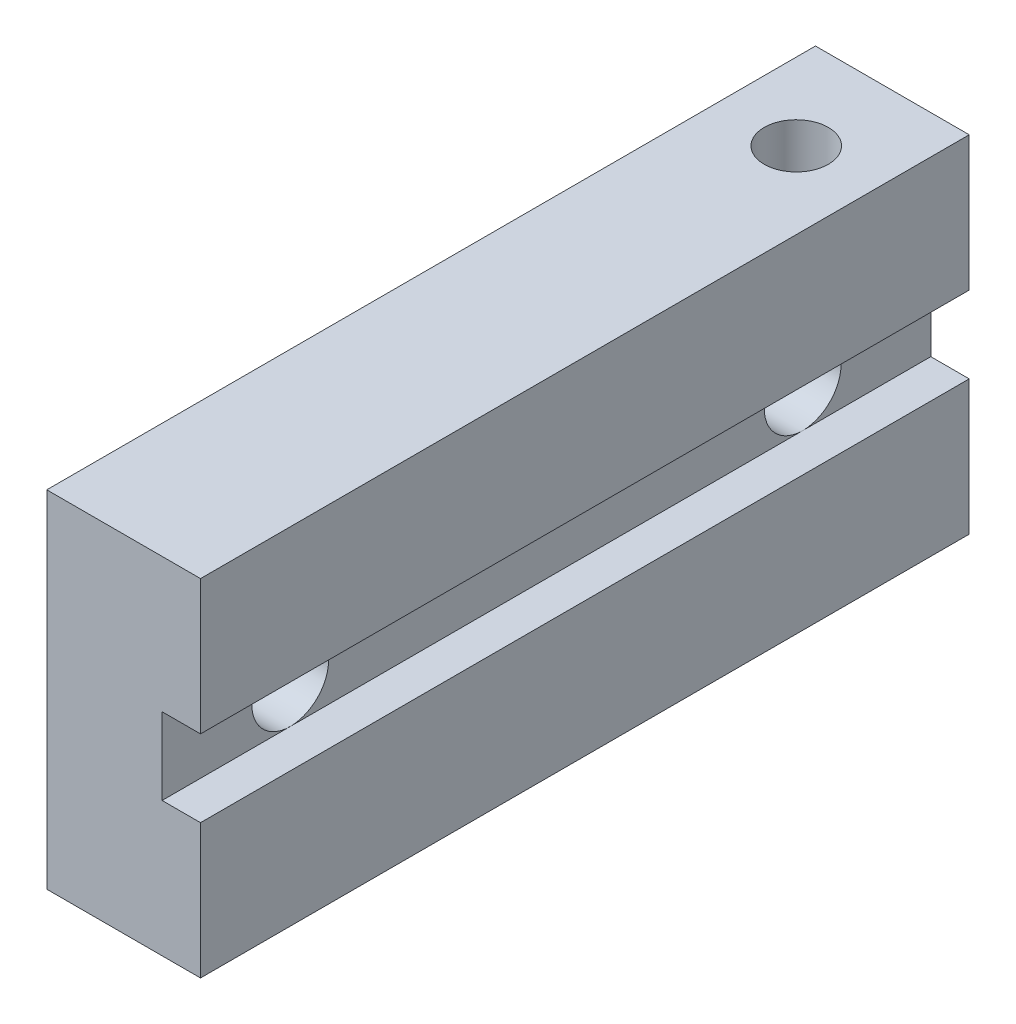
ISO-10303-21;
HEADER;
FILE_DESCRIPTION(('STEP AP214'),'2;1');
FILE_NAME('part.step','',(''),(''),'','','');
FILE_SCHEMA(('AUTOMOTIVE_DESIGN { 1 0 10303 214 1 1 1 1 }'));
ENDSEC;
DATA;
#1=APPLICATION_CONTEXT('core data for automotive mechanical design processes');
#2=APPLICATION_PROTOCOL_DEFINITION('international standard','automotive_design',2000,#1);
#3=PRODUCT_CONTEXT('',#1,'mechanical');
#4=PRODUCT('Part','Part','',(#3));
#5=PRODUCT_RELATED_PRODUCT_CATEGORY('part','',(#4));
#6=PRODUCT_DEFINITION_FORMATION('','',#4);
#7=PRODUCT_DEFINITION_CONTEXT('part definition',#1,'design');
#8=PRODUCT_DEFINITION('design','',#6,#7);
#9=PRODUCT_DEFINITION_SHAPE('','',#8);
#10=(LENGTH_UNIT() NAMED_UNIT(*) SI_UNIT(.MILLI.,.METRE.));
#11=(NAMED_UNIT(*) PLANE_ANGLE_UNIT() SI_UNIT($,.RADIAN.));
#12=(NAMED_UNIT(*) SI_UNIT($,.STERADIAN.) SOLID_ANGLE_UNIT());
#13=UNCERTAINTY_MEASURE_WITH_UNIT(LENGTH_MEASURE(1.E-05),#10,'distance_accuracy_value','');
#14=(GEOMETRIC_REPRESENTATION_CONTEXT(3) GLOBAL_UNCERTAINTY_ASSIGNED_CONTEXT((#13)) GLOBAL_UNIT_ASSIGNED_CONTEXT((#10,
#11,#12)) REPRESENTATION_CONTEXT('',''));
#15=CARTESIAN_POINT('',(0.,0.,0.));
#16=DIRECTION('',(0.,0.,1.));
#17=DIRECTION('',(1.,0.,0.));
#18=AXIS2_PLACEMENT_3D('',#15,#16,#17);
#19=CARTESIAN_POINT('',(8.99999999999999,0.,0.));
#20=DIRECTION('',(1.,0.,0.));
#21=DIRECTION('',(0.,0.,-1.));
#22=AXIS2_PLACEMENT_3D('',#19,#20,#21);
#23=PLANE('',#22);
#24=CARTESIAN_POINT('',(8.99999999999999,0.,20.));
#25=DIRECTION('',(1.,0.,0.));
#26=DIRECTION('',(0.,0.,-1.));
#27=AXIS2_PLACEMENT_3D('',#24,#25,#26);
#28=CIRCLE('',#27,3.);
#29=CARTESIAN_POINT('',(8.99999999999999,3.,20.));
#30=VERTEX_POINT('',#29);
#31=CARTESIAN_POINT('',(8.99999999999999,-3.,20.));
#32=VERTEX_POINT('',#31);
#33=EDGE_CURVE('E47',#30,#32,#28,.T.);
#34=ORIENTED_EDGE('',*,*,#33,.F.);
#35=DIRECTION('',(0.,0.,1.));
#36=VECTOR('',#35,1.);
#37=CARTESIAN_POINT('',(8.99999999999999,3.,0.));
#38=LINE('',#37,#36);
#39=CARTESIAN_POINT('',(8.99999999999999,3.,30.));
#40=VERTEX_POINT('',#39);
#41=EDGE_CURVE('E177',#30,#40,#38,.T.);
#42=ORIENTED_EDGE('',*,*,#41,.T.);
#43=DIRECTION('',(0.,1.,0.));
#44=VECTOR('',#43,1.);
#45=CARTESIAN_POINT('',(8.99999999999999,0.,30.));
#46=LINE('',#45,#44);
#47=CARTESIAN_POINT('',(8.99999999999999,-3.,30.));
#48=VERTEX_POINT('',#47);
#49=EDGE_CURVE('E181',#48,#40,#46,.T.);
#50=ORIENTED_EDGE('',*,*,#49,.F.);
#51=DIRECTION('',(0.,0.,1.));
#52=VECTOR('',#51,1.);
#53=CARTESIAN_POINT('',(8.99999999999999,-3.,0.));
#54=LINE('',#53,#52);
#55=EDGE_CURVE('E185',#32,#48,#54,.T.);
#56=ORIENTED_EDGE('',*,*,#55,.F.);
#57=EDGE_LOOP('',(#34,#42,#50,#56));
#58=FACE_BOUND('',#57,.T.);
#59=ADVANCED_FACE('F33',(#58),#23,.T.);
#60=CARTESIAN_POINT('',(0.,0.,0.));
#61=DIRECTION('',(1.,0.,0.));
#62=DIRECTION('',(0.,0.,-1.));
#63=AXIS2_PLACEMENT_3D('',#60,#61,#62);
#64=PLANE('',#63);
#65=CARTESIAN_POINT('',(0.,0.,-20.));
#66=DIRECTION('',(-1.,0.,0.));
#67=DIRECTION('',(0.,0.,1.));
#68=AXIS2_PLACEMENT_3D('',#65,#66,#67);
#69=CIRCLE('',#68,5.5);
#70=CARTESIAN_POINT('',(0.,0.,-14.5));
#71=VERTEX_POINT('',#70);
#72=EDGE_CURVE('E137',#71,#71,#69,.T.);
#73=ORIENTED_EDGE('',*,*,#72,.F.);
#74=EDGE_LOOP('',(#73));
#75=FACE_BOUND('',#74,.T.);
#76=DIRECTION('',(0.,1.,0.));
#77=VECTOR('',#76,1.);
#78=CARTESIAN_POINT('',(0.,0.,-30.));
#79=LINE('',#78,#77);
#80=CARTESIAN_POINT('',(0.,-13.5,-30.));
#81=VERTEX_POINT('',#80);
#82=CARTESIAN_POINT('',(0.,13.5,-30.));
#83=VERTEX_POINT('',#82);
#84=EDGE_CURVE('E189',#81,#83,#79,.T.);
#85=ORIENTED_EDGE('',*,*,#84,.F.);
#86=DIRECTION('',(0.,0.,1.));
#87=VECTOR('',#86,1.);
#88=CARTESIAN_POINT('',(0.,-13.5,0.));
#89=LINE('',#88,#87);
#90=CARTESIAN_POINT('',(0.,-13.5,30.));
#91=VERTEX_POINT('',#90);
#92=EDGE_CURVE('E152',#81,#91,#89,.T.);
#93=ORIENTED_EDGE('',*,*,#92,.T.);
#94=DIRECTION('',(0.,1.,0.));
#95=VECTOR('',#94,1.);
#96=CARTESIAN_POINT('',(0.,0.,30.));
#97=LINE('',#96,#95);
#98=CARTESIAN_POINT('',(0.,13.5,30.));
#99=VERTEX_POINT('',#98);
#100=EDGE_CURVE('E194',#91,#99,#97,.T.);
#101=ORIENTED_EDGE('',*,*,#100,.T.);
#102=DIRECTION('',(0.,0.,1.));
#103=VECTOR('',#102,1.);
#104=CARTESIAN_POINT('',(0.,13.5,0.));
#105=LINE('',#104,#103);
#106=EDGE_CURVE('E203',#83,#99,#105,.T.);
#107=ORIENTED_EDGE('',*,*,#106,.F.);
#108=EDGE_LOOP('',(#85,#93,#101,#107));
#109=FACE_BOUND('',#108,.T.);
#110=CARTESIAN_POINT('',(0.,0.,20.));
#111=DIRECTION('',(-1.,0.,0.));
#112=DIRECTION('',(0.,0.,1.));
#113=AXIS2_PLACEMENT_3D('',#110,#111,#112);
#114=CIRCLE('',#113,5.5);
#115=CARTESIAN_POINT('',(0.,0.,25.5));
#116=VERTEX_POINT('',#115);
#117=EDGE_CURVE('E121',#116,#116,#114,.T.);
#118=ORIENTED_EDGE('',*,*,#117,.F.);
#119=EDGE_LOOP('',(#118));
#120=FACE_BOUND('',#119,.T.);
#121=ADVANCED_FACE('F221',(#75,#109,#120),#64,.F.);
#122=EDGE_CURVE('E135',#32,#30,#28,.T.);
#123=ORIENTED_EDGE('',*,*,#122,.F.);
#124=CARTESIAN_POINT('',(8.99999999999999,-3.,-20.));
#125=VERTEX_POINT('',#124);
#126=EDGE_CURVE('E190',#125,#32,#54,.T.);
#127=ORIENTED_EDGE('',*,*,#126,.F.);
#128=CARTESIAN_POINT('',(8.99999999999999,0.,-20.));
#129=DIRECTION('',(1.,0.,0.));
#130=DIRECTION('',(0.,0.,-1.));
#131=AXIS2_PLACEMENT_3D('',#128,#129,#130);
#132=CIRCLE('',#131,3.);
#133=CARTESIAN_POINT('',(8.99999999999999,3.,-20.));
#134=VERTEX_POINT('',#133);
#135=EDGE_CURVE('E54',#134,#125,#132,.T.);
#136=ORIENTED_EDGE('',*,*,#135,.F.);
#137=EDGE_CURVE('E182',#134,#30,#38,.T.);
#138=ORIENTED_EDGE('',*,*,#137,.T.);
#139=EDGE_LOOP('',(#123,#127,#136,#138));
#140=FACE_BOUND('',#139,.T.);
#141=ADVANCED_FACE('F256',(#140),#23,.T.);
#142=CARTESIAN_POINT('',(12.,3.,0.));
#143=DIRECTION('',(0.,-1.,0.));
#144=DIRECTION('',(0.,0.,-1.));
#145=AXIS2_PLACEMENT_3D('',#142,#143,#144);
#146=PLANE('',#145);
#147=ORIENTED_EDGE('',*,*,#41,.F.);
#148=ORIENTED_EDGE('',*,*,#137,.F.);
#149=CARTESIAN_POINT('',(8.99999999999999,3.,-30.));
#150=VERTEX_POINT('',#149);
#151=EDGE_CURVE('E178',#150,#134,#38,.T.);
#152=ORIENTED_EDGE('',*,*,#151,.F.);
#153=DIRECTION('',(-1.,0.,0.));
#154=VECTOR('',#153,1.);
#155=CARTESIAN_POINT('',(12.,3.,-30.));
#156=LINE('',#155,#154);
#157=CARTESIAN_POINT('',(12.,3.,-30.));
#158=VERTEX_POINT('',#157);
#159=EDGE_CURVE('E11',#158,#150,#156,.T.);
#160=ORIENTED_EDGE('',*,*,#159,.F.);
#161=DIRECTION('',(0.,0.,1.));
#162=VECTOR('',#161,1.);
#163=CARTESIAN_POINT('',(12.,3.,0.));
#164=LINE('',#163,#162);
#165=CARTESIAN_POINT('',(12.,3.,30.));
#166=VERTEX_POINT('',#165);
#167=EDGE_CURVE('E191',#158,#166,#164,.T.);
#168=ORIENTED_EDGE('',*,*,#167,.T.);
#169=DIRECTION('',(-1.,0.,0.));
#170=VECTOR('',#169,1.);
#171=CARTESIAN_POINT('',(12.,3.,30.));
#172=LINE('',#171,#170);
#173=EDGE_CURVE('E201',#166,#40,#172,.T.);
#174=ORIENTED_EDGE('',*,*,#173,.T.);
#175=EDGE_LOOP('',(#147,#148,#152,#160,#168,#174));
#176=FACE_BOUND('',#175,.T.);
#177=ADVANCED_FACE('F35',(#176),#146,.T.);
#178=CARTESIAN_POINT('',(12.,0.,-30.));
#179=DIRECTION('',(0.,0.,1.));
#180=DIRECTION('',(1.,0.,0.));
#181=AXIS2_PLACEMENT_3D('',#178,#179,#180);
#182=PLANE('',#181);
#183=ORIENTED_EDGE('',*,*,#84,.T.);
#184=DIRECTION('',(-1.,0.,0.));
#185=VECTOR('',#184,1.);
#186=CARTESIAN_POINT('',(12.,13.5,-30.));
#187=LINE('',#186,#185);
#188=CARTESIAN_POINT('',(12.,13.5,-30.));
#189=VERTEX_POINT('',#188);
#190=EDGE_CURVE('E41',#189,#83,#187,.T.);
#191=ORIENTED_EDGE('',*,*,#190,.F.);
#192=DIRECTION('',(0.,1.,0.));
#193=VECTOR('',#192,1.);
#194=CARTESIAN_POINT('',(12.,0.,-30.));
#195=LINE('',#194,#193);
#196=EDGE_CURVE('E193',#158,#189,#195,.T.);
#197=ORIENTED_EDGE('',*,*,#196,.F.);
#198=ORIENTED_EDGE('',*,*,#159,.T.);
#199=DIRECTION('',(0.,1.,0.));
#200=VECTOR('',#199,1.);
#201=CARTESIAN_POINT('',(8.99999999999999,0.,-30.));
#202=LINE('',#201,#200);
#203=CARTESIAN_POINT('',(8.99999999999999,-3.,-30.));
#204=VERTEX_POINT('',#203);
#205=EDGE_CURVE('E174',#204,#150,#202,.T.);
#206=ORIENTED_EDGE('',*,*,#205,.F.);
#207=DIRECTION('',(-1.,0.,0.));
#208=VECTOR('',#207,1.);
#209=CARTESIAN_POINT('',(12.,-3.,-30.));
#210=LINE('',#209,#208);
#211=CARTESIAN_POINT('',(12.,-3.,-30.));
#212=VERTEX_POINT('',#211);
#213=EDGE_CURVE('E171',#212,#204,#210,.T.);
#214=ORIENTED_EDGE('',*,*,#213,.F.);
#215=DIRECTION('',(0.,1.,0.));
#216=VECTOR('',#215,1.);
#217=CARTESIAN_POINT('',(12.,0.,-30.));
#218=LINE('',#217,#216);
#219=CARTESIAN_POINT('',(12.,-13.5,-30.));
#220=VERTEX_POINT('',#219);
#221=EDGE_CURVE('E148',#220,#212,#218,.T.);
#222=ORIENTED_EDGE('',*,*,#221,.F.);
#223=DIRECTION('',(-1.,0.,0.));
#224=VECTOR('',#223,1.);
#225=CARTESIAN_POINT('',(12.,-13.5,-30.));
#226=LINE('',#225,#224);
#227=EDGE_CURVE('E160',#220,#81,#226,.T.);
#228=ORIENTED_EDGE('',*,*,#227,.T.);
#229=EDGE_LOOP('',(#183,#191,#197,#198,#206,#214,#222,#228));
#230=FACE_BOUND('',#229,.T.);
#231=ADVANCED_FACE('F251',(#230),#182,.F.);
#232=CARTESIAN_POINT('',(12.,13.5,0.));
#233=DIRECTION('',(0.,-1.,0.));
#234=DIRECTION('',(0.,0.,-1.));
#235=AXIS2_PLACEMENT_3D('',#232,#233,#234);
#236=PLANE('',#235);
#237=CARTESIAN_POINT('',(6.,13.5,-22.5));
#238=DIRECTION('',(0.,1.,0.));
#239=DIRECTION('',(0.,0.,1.));
#240=AXIS2_PLACEMENT_3D('',#237,#238,#239);
#241=CIRCLE('',#240,2.49999999999999);
#242=CARTESIAN_POINT('',(6.,13.5,-20.));
#243=VERTEX_POINT('',#242);
#244=EDGE_CURVE('E122',#243,#243,#241,.T.);
#245=ORIENTED_EDGE('',*,*,#244,.F.);
#246=EDGE_LOOP('',(#245));
#247=FACE_BOUND('',#246,.T.);
#248=ORIENTED_EDGE('',*,*,#106,.T.);
#249=DIRECTION('',(-1.,0.,0.));
#250=VECTOR('',#249,1.);
#251=CARTESIAN_POINT('',(12.,13.5,30.));
#252=LINE('',#251,#250);
#253=CARTESIAN_POINT('',(12.,13.5,30.));
#254=VERTEX_POINT('',#253);
#255=EDGE_CURVE('E210',#254,#99,#252,.T.);
#256=ORIENTED_EDGE('',*,*,#255,.F.);
#257=DIRECTION('',(0.,0.,1.));
#258=VECTOR('',#257,1.);
#259=CARTESIAN_POINT('',(12.,13.5,0.));
#260=LINE('',#259,#258);
#261=EDGE_CURVE('E196',#189,#254,#260,.T.);
#262=ORIENTED_EDGE('',*,*,#261,.F.);
#263=ORIENTED_EDGE('',*,*,#190,.T.);
#264=EDGE_LOOP('',(#248,#256,#262,#263));
#265=FACE_BOUND('',#264,.T.);
#266=ADVANCED_FACE('F216',(#247,#265),#236,.F.);
#267=CARTESIAN_POINT('',(12.,0.,30.));
#268=DIRECTION('',(0.,0.,1.));
#269=DIRECTION('',(1.,0.,0.));
#270=AXIS2_PLACEMENT_3D('',#267,#268,#269);
#271=PLANE('',#270);
#272=ORIENTED_EDGE('',*,*,#100,.F.);
#273=DIRECTION('',(-1.,0.,0.));
#274=VECTOR('',#273,1.);
#275=CARTESIAN_POINT('',(12.,-13.5,30.));
#276=LINE('',#275,#274);
#277=CARTESIAN_POINT('',(12.,-13.5,30.));
#278=VERTEX_POINT('',#277);
#279=EDGE_CURVE('E165',#278,#91,#276,.T.);
#280=ORIENTED_EDGE('',*,*,#279,.F.);
#281=DIRECTION('',(0.,1.,0.));
#282=VECTOR('',#281,1.);
#283=CARTESIAN_POINT('',(12.,0.,30.));
#284=LINE('',#283,#282);
#285=CARTESIAN_POINT('',(12.,-3.,30.));
#286=VERTEX_POINT('',#285);
#287=EDGE_CURVE('E154',#278,#286,#284,.T.);
#288=ORIENTED_EDGE('',*,*,#287,.T.);
#289=DIRECTION('',(-1.,0.,0.));
#290=VECTOR('',#289,1.);
#291=CARTESIAN_POINT('',(12.,-3.,30.));
#292=LINE('',#291,#290);
#293=EDGE_CURVE('E168',#286,#48,#292,.T.);
#294=ORIENTED_EDGE('',*,*,#293,.T.);
#295=ORIENTED_EDGE('',*,*,#49,.T.);
#296=ORIENTED_EDGE('',*,*,#173,.F.);
#297=DIRECTION('',(0.,1.,0.));
#298=VECTOR('',#297,1.);
#299=CARTESIAN_POINT('',(12.,0.,30.));
#300=LINE('',#299,#298);
#301=EDGE_CURVE('E198',#166,#254,#300,.T.);
#302=ORIENTED_EDGE('',*,*,#301,.T.);
#303=ORIENTED_EDGE('',*,*,#255,.T.);
#304=EDGE_LOOP('',(#272,#280,#288,#294,#295,#296,#302,#303));
#305=FACE_BOUND('',#304,.T.);
#306=ADVANCED_FACE('F225',(#305),#271,.T.);
#307=CARTESIAN_POINT('',(12.,0.,0.));
#308=DIRECTION('',(1.,0.,0.));
#309=DIRECTION('',(0.,0.,-1.));
#310=AXIS2_PLACEMENT_3D('',#307,#308,#309);
#311=PLANE('',#310);
#312=ORIENTED_EDGE('',*,*,#167,.F.);
#313=ORIENTED_EDGE('',*,*,#196,.T.);
#314=ORIENTED_EDGE('',*,*,#261,.T.);
#315=ORIENTED_EDGE('',*,*,#301,.F.);
#316=EDGE_LOOP('',(#312,#313,#314,#315));
#317=FACE_BOUND('',#316,.T.);
#318=ADVANCED_FACE('F250',(#317),#311,.T.);
#319=EDGE_CURVE('E146',#125,#134,#132,.T.);
#320=ORIENTED_EDGE('',*,*,#319,.F.);
#321=EDGE_CURVE('E186',#204,#125,#54,.T.);
#322=ORIENTED_EDGE('',*,*,#321,.F.);
#323=ORIENTED_EDGE('',*,*,#205,.T.);
#324=ORIENTED_EDGE('',*,*,#151,.T.);
#325=EDGE_LOOP('',(#320,#322,#323,#324));
#326=FACE_BOUND('',#325,.T.);
#327=ADVANCED_FACE('F254',(#326),#23,.T.);
#328=CARTESIAN_POINT('',(12.,-3.,0.));
#329=DIRECTION('',(0.,-1.,0.));
#330=DIRECTION('',(0.,0.,-1.));
#331=AXIS2_PLACEMENT_3D('',#328,#329,#330);
#332=PLANE('',#331);
#333=ORIENTED_EDGE('',*,*,#293,.F.);
#334=DIRECTION('',(0.,0.,1.));
#335=VECTOR('',#334,1.);
#336=CARTESIAN_POINT('',(12.,-3.,0.));
#337=LINE('',#336,#335);
#338=EDGE_CURVE('E151',#212,#286,#337,.T.);
#339=ORIENTED_EDGE('',*,*,#338,.F.);
#340=ORIENTED_EDGE('',*,*,#213,.T.);
#341=ORIENTED_EDGE('',*,*,#321,.T.);
#342=ORIENTED_EDGE('',*,*,#126,.T.);
#343=ORIENTED_EDGE('',*,*,#55,.T.);
#344=EDGE_LOOP('',(#333,#339,#340,#341,#342,#343));
#345=FACE_BOUND('',#344,.T.);
#346=ADVANCED_FACE('F238',(#345),#332,.F.);
#347=CARTESIAN_POINT('',(12.,-13.5,0.));
#348=DIRECTION('',(0.,-1.,0.));
#349=DIRECTION('',(0.,0.,-1.));
#350=AXIS2_PLACEMENT_3D('',#347,#348,#349);
#351=PLANE('',#350);
#352=ORIENTED_EDGE('',*,*,#92,.F.);
#353=ORIENTED_EDGE('',*,*,#227,.F.);
#354=DIRECTION('',(0.,0.,1.));
#355=VECTOR('',#354,1.);
#356=CARTESIAN_POINT('',(12.,-13.5,0.));
#357=LINE('',#356,#355);
#358=EDGE_CURVE('E157',#220,#278,#357,.T.);
#359=ORIENTED_EDGE('',*,*,#358,.T.);
#360=ORIENTED_EDGE('',*,*,#279,.T.);
#361=EDGE_LOOP('',(#352,#353,#359,#360));
#362=FACE_BOUND('',#361,.T.);
#363=ADVANCED_FACE('F228',(#362),#351,.T.);
#364=CARTESIAN_POINT('',(12.,0.,0.));
#365=DIRECTION('',(1.,0.,0.));
#366=DIRECTION('',(0.,0.,-1.));
#367=AXIS2_PLACEMENT_3D('',#364,#365,#366);
#368=PLANE('',#367);
#369=ORIENTED_EDGE('',*,*,#221,.T.);
#370=ORIENTED_EDGE('',*,*,#338,.T.);
#371=ORIENTED_EDGE('',*,*,#287,.F.);
#372=ORIENTED_EDGE('',*,*,#358,.F.);
#373=EDGE_LOOP('',(#369,#370,#371,#372));
#374=FACE_BOUND('',#373,.T.);
#375=ADVANCED_FACE('F232',(#374),#368,.T.);
#376=CARTESIAN_POINT('',(0.,0.,-20.));
#377=DIRECTION('',(-1.,0.,0.));
#378=DIRECTION('',(0.,0.,1.));
#379=AXIS2_PLACEMENT_3D('',#376,#377,#378);
#380=CYLINDRICAL_SURFACE('',#379,3.);
#381=ORIENTED_EDGE('',*,*,#135,.T.);
#382=ORIENTED_EDGE('',*,*,#319,.T.);
#383=EDGE_LOOP('',(#381,#382));
#384=FACE_BOUND('',#383,.T.);
#385=CARTESIAN_POINT('',(3.7,0.,-20.));
#386=DIRECTION('',(-1.,0.,0.));
#387=DIRECTION('',(0.,0.,1.));
#388=AXIS2_PLACEMENT_3D('',#385,#386,#387);
#389=CIRCLE('',#388,3.);
#390=CARTESIAN_POINT('',(3.7,0.,-17.));
#391=VERTEX_POINT('',#390);
#392=EDGE_CURVE('E143',#391,#391,#389,.T.);
#393=ORIENTED_EDGE('',*,*,#392,.T.);
#394=EDGE_LOOP('',(#393));
#395=FACE_BOUND('',#394,.T.);
#396=ADVANCED_FACE('F397',(#384,#395),#380,.F.);
#397=CARTESIAN_POINT('',(3.7,2.99999999999999,-20.));
#398=DIRECTION('',(1.,0.,0.));
#399=DIRECTION('',(0.,0.,-1.));
#400=AXIS2_PLACEMENT_3D('',#397,#398,#399);
#401=PLANE('',#400);
#402=ORIENTED_EDGE('',*,*,#392,.F.);
#403=EDGE_LOOP('',(#402));
#404=FACE_BOUND('',#403,.T.);
#405=CARTESIAN_POINT('',(3.7,0.,-20.));
#406=DIRECTION('',(-1.,0.,0.));
#407=DIRECTION('',(0.,0.,1.));
#408=AXIS2_PLACEMENT_3D('',#405,#406,#407);
#409=CIRCLE('',#408,5.5);
#410=CARTESIAN_POINT('',(3.7,0.,-14.5));
#411=VERTEX_POINT('',#410);
#412=EDGE_CURVE('E140',#411,#411,#409,.T.);
#413=ORIENTED_EDGE('',*,*,#412,.T.);
#414=EDGE_LOOP('',(#413));
#415=FACE_BOUND('',#414,.T.);
#416=ADVANCED_FACE('F393',(#404,#415),#401,.F.);
#417=CARTESIAN_POINT('',(0.,0.,-20.));
#418=DIRECTION('',(-1.,0.,0.));
#419=DIRECTION('',(0.,0.,1.));
#420=AXIS2_PLACEMENT_3D('',#417,#418,#419);
#421=CYLINDRICAL_SURFACE('',#420,5.5);
#422=ORIENTED_EDGE('',*,*,#412,.F.);
#423=EDGE_LOOP('',(#422));
#424=FACE_BOUND('',#423,.T.);
#425=ORIENTED_EDGE('',*,*,#72,.T.);
#426=EDGE_LOOP('',(#425));
#427=FACE_BOUND('',#426,.T.);
#428=ADVANCED_FACE('F261',(#424,#427),#421,.F.);
#429=CARTESIAN_POINT('',(0.,0.,20.));
#430=DIRECTION('',(-1.,0.,0.));
#431=DIRECTION('',(0.,0.,1.));
#432=AXIS2_PLACEMENT_3D('',#429,#430,#431);
#433=CYLINDRICAL_SURFACE('',#432,3.);
#434=ORIENTED_EDGE('',*,*,#33,.T.);
#435=ORIENTED_EDGE('',*,*,#122,.T.);
#436=EDGE_LOOP('',(#434,#435));
#437=FACE_BOUND('',#436,.T.);
#438=CARTESIAN_POINT('',(3.7,0.,20.));
#439=DIRECTION('',(-1.,0.,0.));
#440=DIRECTION('',(0.,0.,1.));
#441=AXIS2_PLACEMENT_3D('',#438,#439,#440);
#442=CIRCLE('',#441,3.);
#443=CARTESIAN_POINT('',(3.7,0.,23.));
#444=VERTEX_POINT('',#443);
#445=EDGE_CURVE('E132',#444,#444,#442,.T.);
#446=ORIENTED_EDGE('',*,*,#445,.T.);
#447=EDGE_LOOP('',(#446));
#448=FACE_BOUND('',#447,.T.);
#449=ADVANCED_FACE('F257',(#437,#448),#433,.F.);
#450=CARTESIAN_POINT('',(3.7,3.,20.));
#451=DIRECTION('',(1.,0.,0.));
#452=DIRECTION('',(0.,0.,-1.));
#453=AXIS2_PLACEMENT_3D('',#450,#451,#452);
#454=PLANE('',#453);
#455=ORIENTED_EDGE('',*,*,#445,.F.);
#456=EDGE_LOOP('',(#455));
#457=FACE_BOUND('',#456,.T.);
#458=CARTESIAN_POINT('',(3.7,0.,20.));
#459=DIRECTION('',(-1.,0.,0.));
#460=DIRECTION('',(0.,0.,1.));
#461=AXIS2_PLACEMENT_3D('',#458,#459,#460);
#462=CIRCLE('',#461,5.5);
#463=CARTESIAN_POINT('',(3.7,0.,25.5));
#464=VERTEX_POINT('',#463);
#465=EDGE_CURVE('E125',#464,#464,#462,.T.);
#466=ORIENTED_EDGE('',*,*,#465,.T.);
#467=EDGE_LOOP('',(#466));
#468=FACE_BOUND('',#467,.T.);
#469=ADVANCED_FACE('F260',(#457,#468),#454,.F.);
#470=CARTESIAN_POINT('',(0.,0.,20.));
#471=DIRECTION('',(-1.,0.,0.));
#472=DIRECTION('',(0.,0.,1.));
#473=AXIS2_PLACEMENT_3D('',#470,#471,#472);
#474=CYLINDRICAL_SURFACE('',#473,5.5);
#475=ORIENTED_EDGE('',*,*,#465,.F.);
#476=EDGE_LOOP('',(#475));
#477=FACE_BOUND('',#476,.T.);
#478=ORIENTED_EDGE('',*,*,#117,.T.);
#479=EDGE_LOOP('',(#478));
#480=FACE_BOUND('',#479,.T.);
#481=ADVANCED_FACE('F115',(#477,#480),#474,.F.);
#482=CARTESIAN_POINT('',(6.,5.3,-22.5));
#483=DIRECTION('',(0.,1.,0.));
#484=DIRECTION('',(0.,0.,1.));
#485=AXIS2_PLACEMENT_3D('',#482,#483,#484);
#486=CONICAL_SURFACE('',#485,2.5,1.02974425867665);
#487=CARTESIAN_POINT('',(6.,3.7978484524311,-22.5));
#488=VERTEX_POINT('',#487);
#489=VERTEX_LOOP('',#488);
#490=FACE_BOUND('',#489,.T.);
#491=CARTESIAN_POINT('',(6.,5.3,-22.5));
#492=DIRECTION('',(0.,1.,0.));
#493=DIRECTION('',(0.,0.,1.));
#494=AXIS2_PLACEMENT_3D('',#491,#492,#493);
#495=CIRCLE('',#494,2.5);
#496=CARTESIAN_POINT('',(6.,5.3,-20.));
#497=VERTEX_POINT('',#496);
#498=EDGE_CURVE('E119',#497,#497,#495,.T.);
#499=ORIENTED_EDGE('',*,*,#498,.T.);
#500=EDGE_LOOP('',(#499));
#501=FACE_BOUND('',#500,.T.);
#502=ADVANCED_FACE('F111',(#490,#501),#486,.F.);
#503=CARTESIAN_POINT('',(6.,13.5,-22.5));
#504=DIRECTION('',(0.,1.,0.));
#505=DIRECTION('',(0.,0.,1.));
#506=AXIS2_PLACEMENT_3D('',#503,#504,#505);
#507=CYLINDRICAL_SURFACE('',#506,2.49999999999999);
#508=ORIENTED_EDGE('',*,*,#498,.F.);
#509=EDGE_LOOP('',(#508));
#510=FACE_BOUND('',#509,.T.);
#511=ORIENTED_EDGE('',*,*,#244,.T.);
#512=EDGE_LOOP('',(#511));
#513=FACE_BOUND('',#512,.T.);
#514=ADVANCED_FACE('F114',(#510,#513),#507,.F.);
#515=CLOSED_SHELL('',(#59,#121,#141,#177,#231,#266,#306,#318,#327,#346,#363,#375,#396,#416,#428,
#449,#469,#481,#502,#514));
#516=MANIFOLD_SOLID_BREP('B2',#515);
#517=ADVANCED_BREP_SHAPE_REPRESENTATION('',(#18,#516),#14);
#518=SHAPE_DEFINITION_REPRESENTATION(#9,#517);
ENDSEC;
END-ISO-10303-21;
